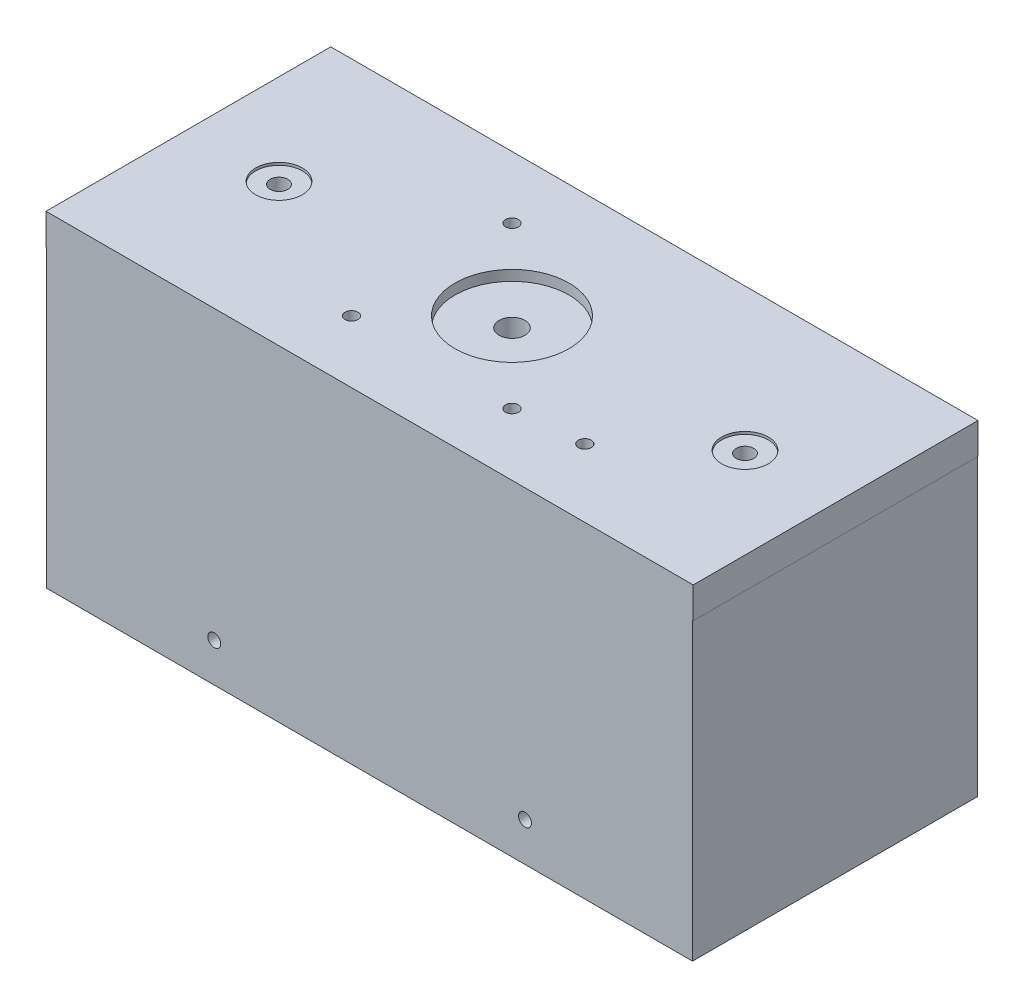
ISO-10303-21;
HEADER;
FILE_DESCRIPTION(('STEP AP214'),'2;1');
FILE_NAME('part.step','',(''),(''),'','','');
FILE_SCHEMA(('AUTOMOTIVE_DESIGN { 1 0 10303 214 1 1 1 1 }'));
ENDSEC;
DATA;
#1=APPLICATION_CONTEXT('core data for automotive mechanical design processes');
#2=APPLICATION_PROTOCOL_DEFINITION('international standard','automotive_design',2000,#1);
#3=PRODUCT_CONTEXT('',#1,'mechanical');
#4=PRODUCT('Part','Part','',(#3));
#5=PRODUCT_RELATED_PRODUCT_CATEGORY('part','',(#4));
#6=PRODUCT_DEFINITION_FORMATION('','',#4);
#7=PRODUCT_DEFINITION_CONTEXT('part definition',#1,'design');
#8=PRODUCT_DEFINITION('design','',#6,#7);
#9=PRODUCT_DEFINITION_SHAPE('','',#8);
#10=(LENGTH_UNIT() NAMED_UNIT(*) SI_UNIT(.MILLI.,.METRE.));
#11=(NAMED_UNIT(*) PLANE_ANGLE_UNIT() SI_UNIT($,.RADIAN.));
#12=(NAMED_UNIT(*) SI_UNIT($,.STERADIAN.) SOLID_ANGLE_UNIT());
#13=UNCERTAINTY_MEASURE_WITH_UNIT(LENGTH_MEASURE(1.E-05),#10,'distance_accuracy_value','');
#14=(GEOMETRIC_REPRESENTATION_CONTEXT(3) GLOBAL_UNCERTAINTY_ASSIGNED_CONTEXT((#13)) GLOBAL_UNIT_ASSIGNED_CONTEXT((#10,
#11,#12)) REPRESENTATION_CONTEXT('',''));
#15=CARTESIAN_POINT('',(0.,0.,0.));
#16=DIRECTION('',(0.,0.,1.));
#17=DIRECTION('',(1.,0.,0.));
#18=AXIS2_PLACEMENT_3D('',#15,#16,#17);
#19=CARTESIAN_POINT('',(0.,0.,0.));
#20=DIRECTION('',(0.,1.,0.));
#21=DIRECTION('',(0.,0.,1.));
#22=AXIS2_PLACEMENT_3D('',#19,#20,#21);
#23=PLANE('',#22);
#24=DIRECTION('',(0.,0.,-1.));
#25=VECTOR('',#24,1.);
#26=CARTESIAN_POINT('',(-62.3619957512419,0.,-27.5));
#27=LINE('',#26,#25);
#28=CARTESIAN_POINT('',(-62.3619957512419,0.,27.5));
#29=VERTEX_POINT('',#28);
#30=CARTESIAN_POINT('',(-62.3619957512419,0.,-27.5));
#31=VERTEX_POINT('',#30);
#32=EDGE_CURVE('E146',#29,#31,#27,.T.);
#33=ORIENTED_EDGE('',*,*,#32,.F.);
#34=DIRECTION('',(1.,0.,0.));
#35=VECTOR('',#34,1.);
#36=CARTESIAN_POINT('',(-62.5,0.,27.5));
#37=LINE('',#36,#35);
#38=CARTESIAN_POINT('',(-62.5,0.,27.5));
#39=VERTEX_POINT('',#38);
#40=EDGE_CURVE('E236',#39,#29,#37,.T.);
#41=ORIENTED_EDGE('',*,*,#40,.F.);
#42=DIRECTION('',(0.,0.,1.));
#43=VECTOR('',#42,1.);
#44=CARTESIAN_POINT('',(-62.5,0.,-27.5));
#45=LINE('',#44,#43);
#46=CARTESIAN_POINT('',(-62.5,0.,-27.5));
#47=VERTEX_POINT('',#46);
#48=EDGE_CURVE('E248',#47,#39,#45,.T.);
#49=ORIENTED_EDGE('',*,*,#48,.F.);
#50=DIRECTION('',(-1.,0.,0.));
#51=VECTOR('',#50,1.);
#52=CARTESIAN_POINT('',(-62.5,0.,-27.5));
#53=LINE('',#52,#51);
#54=EDGE_CURVE('E63',#31,#47,#53,.T.);
#55=ORIENTED_EDGE('',*,*,#54,.F.);
#56=EDGE_LOOP('',(#33,#41,#49,#55));
#57=FACE_BOUND('',#56,.T.);
#58=ADVANCED_FACE('F38',(#57),#23,.F.);
#59=DIRECTION('',(0.,0.,1.));
#60=VECTOR('',#59,1.);
#61=CARTESIAN_POINT('',(62.3619957512418,0.,-27.5));
#62=LINE('',#61,#60);
#63=CARTESIAN_POINT('',(62.3619957512418,0.,-27.5));
#64=VERTEX_POINT('',#63);
#65=CARTESIAN_POINT('',(62.3619957512418,0.,27.5));
#66=VERTEX_POINT('',#65);
#67=EDGE_CURVE('E176',#64,#66,#62,.T.);
#68=ORIENTED_EDGE('',*,*,#67,.F.);
#69=CARTESIAN_POINT('',(62.5,0.,-27.5));
#70=VERTEX_POINT('',#69);
#71=EDGE_CURVE('E245',#70,#64,#53,.T.);
#72=ORIENTED_EDGE('',*,*,#71,.F.);
#73=DIRECTION('',(0.,0.,-1.));
#74=VECTOR('',#73,1.);
#75=CARTESIAN_POINT('',(62.5,0.,-27.5));
#76=LINE('',#75,#74);
#77=CARTESIAN_POINT('',(62.5,0.,27.5));
#78=VERTEX_POINT('',#77);
#79=EDGE_CURVE('E229',#78,#70,#76,.T.);
#80=ORIENTED_EDGE('',*,*,#79,.F.);
#81=EDGE_CURVE('E250',#66,#78,#37,.T.);
#82=ORIENTED_EDGE('',*,*,#81,.F.);
#83=EDGE_LOOP('',(#68,#72,#80,#82));
#84=FACE_BOUND('',#83,.T.);
#85=ADVANCED_FACE('F316',(#84),#23,.F.);
#86=CARTESIAN_POINT('',(62.5,6.,-27.5));
#87=DIRECTION('',(-1.,0.,0.));
#88=DIRECTION('',(0.,0.,1.));
#89=AXIS2_PLACEMENT_3D('',#86,#87,#88);
#90=PLANE('',#89);
#91=ORIENTED_EDGE('',*,*,#79,.T.);
#92=DIRECTION('',(0.,-1.,0.));
#93=VECTOR('',#92,1.);
#94=CARTESIAN_POINT('',(62.5,6.,-27.5));
#95=LINE('',#94,#93);
#96=CARTESIAN_POINT('',(62.5,6.,-27.5));
#97=VERTEX_POINT('',#96);
#98=EDGE_CURVE('E11',#97,#70,#95,.T.);
#99=ORIENTED_EDGE('',*,*,#98,.F.);
#100=DIRECTION('',(0.,0.,-1.));
#101=VECTOR('',#100,1.);
#102=CARTESIAN_POINT('',(62.5,6.,-27.5));
#103=LINE('',#102,#101);
#104=CARTESIAN_POINT('',(62.5,6.,27.5));
#105=VERTEX_POINT('',#104);
#106=EDGE_CURVE('E232',#105,#97,#103,.T.);
#107=ORIENTED_EDGE('',*,*,#106,.F.);
#108=DIRECTION('',(0.,-1.,0.));
#109=VECTOR('',#108,1.);
#110=CARTESIAN_POINT('',(62.5,6.,27.5));
#111=LINE('',#110,#109);
#112=EDGE_CURVE('E242',#105,#78,#111,.T.);
#113=ORIENTED_EDGE('',*,*,#112,.T.);
#114=EDGE_LOOP('',(#91,#99,#107,#113));
#115=FACE_BOUND('',#114,.T.);
#116=ADVANCED_FACE('F40',(#115),#90,.F.);
#117=CARTESIAN_POINT('',(-62.5,6.,-27.5));
#118=DIRECTION('',(0.,0.,1.));
#119=DIRECTION('',(1.,0.,0.));
#120=AXIS2_PLACEMENT_3D('',#117,#118,#119);
#121=PLANE('',#120);
#122=CARTESIAN_POINT('',(-30.,-49.5,-27.5));
#123=DIRECTION('',(0.,0.,-1.));
#124=DIRECTION('',(-1.,0.,0.));
#125=AXIS2_PLACEMENT_3D('',#122,#123,#124);
#126=CIRCLE('',#125,1.24999999999999);
#127=CARTESIAN_POINT('',(-31.25,-49.5,-27.5));
#128=VERTEX_POINT('',#127);
#129=EDGE_CURVE('E288',#128,#128,#126,.T.);
#130=ORIENTED_EDGE('',*,*,#129,.F.);
#131=EDGE_LOOP('',(#130));
#132=FACE_BOUND('',#131,.T.);
#133=CARTESIAN_POINT('',(30.,-49.5,-27.5));
#134=DIRECTION('',(0.,0.,-1.));
#135=DIRECTION('',(-1.,0.,0.));
#136=AXIS2_PLACEMENT_3D('',#133,#134,#135);
#137=CIRCLE('',#136,1.24999999999999);
#138=CARTESIAN_POINT('',(28.75,-49.5,-27.5));
#139=VERTEX_POINT('',#138);
#140=EDGE_CURVE('E294',#139,#139,#137,.T.);
#141=ORIENTED_EDGE('',*,*,#140,.F.);
#142=EDGE_LOOP('',(#141));
#143=FACE_BOUND('',#142,.T.);
#144=ORIENTED_EDGE('',*,*,#71,.T.);
#145=DIRECTION('',(0.,1.,0.));
#146=VECTOR('',#145,1.);
#147=CARTESIAN_POINT('',(62.3619957512418,-57.,-27.5));
#148=LINE('',#147,#146);
#149=CARTESIAN_POINT('',(62.3619957512418,-57.,-27.5));
#150=VERTEX_POINT('',#149);
#151=EDGE_CURVE('E192',#150,#64,#148,.T.);
#152=ORIENTED_EDGE('',*,*,#151,.F.);
#153=DIRECTION('',(1.,0.,0.));
#154=VECTOR('',#153,1.);
#155=CARTESIAN_POINT('',(62.3619957512418,-57.,-27.5));
#156=LINE('',#155,#154);
#157=CARTESIAN_POINT('',(-62.3619957512419,-57.,-27.5));
#158=VERTEX_POINT('',#157);
#159=EDGE_CURVE('E175',#158,#150,#156,.T.);
#160=ORIENTED_EDGE('',*,*,#159,.F.);
#161=DIRECTION('',(0.,1.,0.));
#162=VECTOR('',#161,1.);
#163=CARTESIAN_POINT('',(-62.3619957512419,-57.,-27.5));
#164=LINE('',#163,#162);
#165=EDGE_CURVE('E195',#158,#31,#164,.T.);
#166=ORIENTED_EDGE('',*,*,#165,.T.);
#167=ORIENTED_EDGE('',*,*,#54,.T.);
#168=DIRECTION('',(0.,-1.,0.));
#169=VECTOR('',#168,1.);
#170=CARTESIAN_POINT('',(-62.5,6.,-27.5));
#171=LINE('',#170,#169);
#172=CARTESIAN_POINT('',(-62.5,6.,-27.5));
#173=VERTEX_POINT('',#172);
#174=EDGE_CURVE('E47',#173,#47,#171,.T.);
#175=ORIENTED_EDGE('',*,*,#174,.F.);
#176=DIRECTION('',(-1.,0.,0.));
#177=VECTOR('',#176,1.);
#178=CARTESIAN_POINT('',(-62.5,6.,-27.5));
#179=LINE('',#178,#177);
#180=EDGE_CURVE('E235',#97,#173,#179,.T.);
#181=ORIENTED_EDGE('',*,*,#180,.F.);
#182=ORIENTED_EDGE('',*,*,#98,.T.);
#183=EDGE_LOOP('',(#144,#152,#160,#166,#167,#175,#181,#182));
#184=FACE_BOUND('',#183,.T.);
#185=ADVANCED_FACE('F395',(#132,#143,#184),#121,.F.);
#186=CARTESIAN_POINT('',(-62.5,6.,-27.5));
#187=DIRECTION('',(1.,0.,0.));
#188=DIRECTION('',(0.,0.,-1.));
#189=AXIS2_PLACEMENT_3D('',#186,#187,#188);
#190=PLANE('',#189);
#191=ORIENTED_EDGE('',*,*,#48,.T.);
#192=DIRECTION('',(0.,-1.,0.));
#193=VECTOR('',#192,1.);
#194=CARTESIAN_POINT('',(-62.5,6.,27.5));
#195=LINE('',#194,#193);
#196=CARTESIAN_POINT('',(-62.5,6.,27.5));
#197=VERTEX_POINT('',#196);
#198=EDGE_CURVE('E255',#197,#39,#195,.T.);
#199=ORIENTED_EDGE('',*,*,#198,.F.);
#200=DIRECTION('',(0.,0.,1.));
#201=VECTOR('',#200,1.);
#202=CARTESIAN_POINT('',(-62.5,6.,-27.5));
#203=LINE('',#202,#201);
#204=EDGE_CURVE('E238',#173,#197,#203,.T.);
#205=ORIENTED_EDGE('',*,*,#204,.F.);
#206=ORIENTED_EDGE('',*,*,#174,.T.);
#207=EDGE_LOOP('',(#191,#199,#205,#206));
#208=FACE_BOUND('',#207,.T.);
#209=ADVANCED_FACE('F404',(#208),#190,.F.);
#210=CARTESIAN_POINT('',(-62.5,6.,27.5));
#211=DIRECTION('',(0.,0.,-1.));
#212=DIRECTION('',(-1.,0.,0.));
#213=AXIS2_PLACEMENT_3D('',#210,#211,#212);
#214=PLANE('',#213);
#215=CARTESIAN_POINT('',(30.,-49.5,27.5));
#216=DIRECTION('',(0.,0.,1.));
#217=DIRECTION('',(1.,0.,0.));
#218=AXIS2_PLACEMENT_3D('',#215,#216,#217);
#219=CIRCLE('',#218,1.24999999999999);
#220=CARTESIAN_POINT('',(31.25,-49.5,27.5));
#221=VERTEX_POINT('',#220);
#222=EDGE_CURVE('E263',#221,#221,#219,.T.);
#223=ORIENTED_EDGE('',*,*,#222,.F.);
#224=EDGE_LOOP('',(#223));
#225=FACE_BOUND('',#224,.T.);
#226=CARTESIAN_POINT('',(-30.,-49.5,27.5));
#227=DIRECTION('',(0.,0.,1.));
#228=DIRECTION('',(1.,0.,0.));
#229=AXIS2_PLACEMENT_3D('',#226,#227,#228);
#230=CIRCLE('',#229,1.24999999999999);
#231=CARTESIAN_POINT('',(-28.75,-49.5,27.5));
#232=VERTEX_POINT('',#231);
#233=EDGE_CURVE('E282',#232,#232,#230,.T.);
#234=ORIENTED_EDGE('',*,*,#233,.F.);
#235=EDGE_LOOP('',(#234));
#236=FACE_BOUND('',#235,.T.);
#237=ORIENTED_EDGE('',*,*,#40,.T.);
#238=DIRECTION('',(0.,1.,0.));
#239=VECTOR('',#238,1.);
#240=CARTESIAN_POINT('',(-62.3619957512419,-57.,27.5));
#241=LINE('',#240,#239);
#242=CARTESIAN_POINT('',(-62.3619957512419,-57.,27.5));
#243=VERTEX_POINT('',#242);
#244=EDGE_CURVE('E182',#243,#29,#241,.T.);
#245=ORIENTED_EDGE('',*,*,#244,.F.);
#246=DIRECTION('',(-1.,0.,0.));
#247=VECTOR('',#246,1.);
#248=CARTESIAN_POINT('',(62.3619957512418,-57.,27.5));
#249=LINE('',#248,#247);
#250=CARTESIAN_POINT('',(62.3619957512418,-57.,27.5));
#251=VERTEX_POINT('',#250);
#252=EDGE_CURVE('E180',#251,#243,#249,.T.);
#253=ORIENTED_EDGE('',*,*,#252,.F.);
#254=DIRECTION('',(0.,1.,0.));
#255=VECTOR('',#254,1.);
#256=CARTESIAN_POINT('',(62.3619957512418,-57.,27.5));
#257=LINE('',#256,#255);
#258=EDGE_CURVE('E189',#251,#66,#257,.T.);
#259=ORIENTED_EDGE('',*,*,#258,.T.);
#260=ORIENTED_EDGE('',*,*,#81,.T.);
#261=ORIENTED_EDGE('',*,*,#112,.F.);
#262=DIRECTION('',(1.,0.,0.));
#263=VECTOR('',#262,1.);
#264=CARTESIAN_POINT('',(-62.5,6.,27.5));
#265=LINE('',#264,#263);
#266=EDGE_CURVE('E240',#197,#105,#265,.T.);
#267=ORIENTED_EDGE('',*,*,#266,.F.);
#268=ORIENTED_EDGE('',*,*,#198,.T.);
#269=EDGE_LOOP('',(#237,#245,#253,#259,#260,#261,#267,#268));
#270=FACE_BOUND('',#269,.T.);
#271=ADVANCED_FACE('F336',(#225,#236,#270),#214,.F.);
#272=CARTESIAN_POINT('',(0.,6.,0.));
#273=DIRECTION('',(0.,1.,0.));
#274=DIRECTION('',(0.,0.,1.));
#275=AXIS2_PLACEMENT_3D('',#272,#273,#274);
#276=PLANE('',#275);
#277=CARTESIAN_POINT('',(-45.,6.,0.));
#278=DIRECTION('',(0.,1.,0.));
#279=DIRECTION('',(0.,0.,1.));
#280=AXIS2_PLACEMENT_3D('',#277,#278,#279);
#281=CIRCLE('',#280,4.49999999999999);
#282=CARTESIAN_POINT('',(-45.,6.,4.5));
#283=VERTEX_POINT('',#282);
#284=EDGE_CURVE('E494',#283,#283,#281,.T.);
#285=ORIENTED_EDGE('',*,*,#284,.F.);
#286=EDGE_LOOP('',(#285));
#287=FACE_BOUND('',#286,.T.);
#288=CARTESIAN_POINT('',(45.,6.,0.));
#289=DIRECTION('',(0.,1.,0.));
#290=DIRECTION('',(0.,0.,1.));
#291=AXIS2_PLACEMENT_3D('',#288,#289,#290);
#292=CIRCLE('',#291,4.49999999999999);
#293=CARTESIAN_POINT('',(45.,6.,4.49999999999999));
#294=VERTEX_POINT('',#293);
#295=EDGE_CURVE('E504',#294,#294,#292,.T.);
#296=ORIENTED_EDGE('',*,*,#295,.F.);
#297=EDGE_LOOP('',(#296));
#298=FACE_BOUND('',#297,.T.);
#299=CARTESIAN_POINT('',(28.4442697657839,6.,14.3794846236689));
#300=DIRECTION('',(0.,1.,0.));
#301=DIRECTION('',(0.,0.,1.));
#302=AXIS2_PLACEMENT_3D('',#299,#300,#301);
#303=CIRCLE('',#302,1.24999999999999);
#304=CARTESIAN_POINT('',(28.4442697657839,6.,15.6294846236688));
#305=VERTEX_POINT('',#304);
#306=EDGE_CURVE('E197',#305,#305,#303,.T.);
#307=ORIENTED_EDGE('',*,*,#306,.F.);
#308=EDGE_LOOP('',(#307));
#309=FACE_BOUND('',#308,.T.);
#310=CARTESIAN_POINT('',(15.5,6.,15.5));
#311=DIRECTION('',(0.,1.,0.));
#312=DIRECTION('',(0.,0.,1.));
#313=AXIS2_PLACEMENT_3D('',#310,#311,#312);
#314=CIRCLE('',#313,1.24999999999999);
#315=CARTESIAN_POINT('',(15.5,6.,16.75));
#316=VERTEX_POINT('',#315);
#317=EDGE_CURVE('E203',#316,#316,#314,.T.);
#318=ORIENTED_EDGE('',*,*,#317,.F.);
#319=EDGE_LOOP('',(#318));
#320=FACE_BOUND('',#319,.T.);
#321=CARTESIAN_POINT('',(-15.5,6.,15.5));
#322=DIRECTION('',(0.,1.,0.));
#323=DIRECTION('',(0.,0.,1.));
#324=AXIS2_PLACEMENT_3D('',#321,#322,#323);
#325=CIRCLE('',#324,1.24999999999999);
#326=CARTESIAN_POINT('',(-15.5,6.,16.75));
#327=VERTEX_POINT('',#326);
#328=EDGE_CURVE('E209',#327,#327,#325,.T.);
#329=ORIENTED_EDGE('',*,*,#328,.F.);
#330=EDGE_LOOP('',(#329));
#331=FACE_BOUND('',#330,.T.);
#332=CARTESIAN_POINT('',(-15.5,6.,-15.5));
#333=DIRECTION('',(0.,1.,0.));
#334=DIRECTION('',(0.,0.,1.));
#335=AXIS2_PLACEMENT_3D('',#332,#333,#334);
#336=CIRCLE('',#335,1.24999999999999);
#337=CARTESIAN_POINT('',(-15.5,6.,-14.25));
#338=VERTEX_POINT('',#337);
#339=EDGE_CURVE('E215',#338,#338,#336,.T.);
#340=ORIENTED_EDGE('',*,*,#339,.F.);
#341=EDGE_LOOP('',(#340));
#342=FACE_BOUND('',#341,.T.);
#343=CARTESIAN_POINT('',(0.,6.,0.));
#344=DIRECTION('',(0.,1.,0.));
#345=DIRECTION('',(0.,0.,1.));
#346=AXIS2_PLACEMENT_3D('',#343,#344,#345);
#347=CIRCLE('',#346,11.);
#348=CARTESIAN_POINT('',(0.,6.,11.));
#349=VERTEX_POINT('',#348);
#350=EDGE_CURVE('E225',#349,#349,#347,.T.);
#351=ORIENTED_EDGE('',*,*,#350,.F.);
#352=EDGE_LOOP('',(#351));
#353=FACE_BOUND('',#352,.T.);
#354=ORIENTED_EDGE('',*,*,#106,.T.);
#355=ORIENTED_EDGE('',*,*,#180,.T.);
#356=ORIENTED_EDGE('',*,*,#204,.T.);
#357=ORIENTED_EDGE('',*,*,#266,.T.);
#358=EDGE_LOOP('',(#354,#355,#356,#357));
#359=FACE_BOUND('',#358,.T.);
#360=ADVANCED_FACE('F327',(#287,#298,#309,#320,#331,#342,#353,#359),#276,.T.);
#361=CARTESIAN_POINT('',(-45.,0.,0.));
#362=DIRECTION('',(0.,1.,0.));
#363=DIRECTION('',(0.,0.,1.));
#364=AXIS2_PLACEMENT_3D('',#361,#362,#363);
#365=CIRCLE('',#364,0.0357205176494837);
#366=CARTESIAN_POINT('',(-45.,0.,0.0357205176494893));
#367=VERTEX_POINT('',#366);
#368=EDGE_CURVE('E42',#367,#367,#365,.T.);
#369=ORIENTED_EDGE('',*,*,#368,.T.);
#370=EDGE_LOOP('',(#369));
#371=FACE_BOUND('',#370,.T.);
#372=CARTESIAN_POINT('',(45.,0.,0.));
#373=DIRECTION('',(0.,1.,0.));
#374=DIRECTION('',(0.,0.,1.));
#375=AXIS2_PLACEMENT_3D('',#372,#373,#374);
#376=CIRCLE('',#375,0.0357205176494837);
#377=CARTESIAN_POINT('',(45.,0.,0.0357205176494838));
#378=VERTEX_POINT('',#377);
#379=EDGE_CURVE('E261',#378,#378,#376,.T.);
#380=ORIENTED_EDGE('',*,*,#379,.T.);
#381=EDGE_LOOP('',(#380));
#382=FACE_BOUND('',#381,.T.);
#383=DIRECTION('',(-1.,0.,0.));
#384=VECTOR('',#383,1.);
#385=CARTESIAN_POINT('',(60.,0.,25.));
#386=LINE('',#385,#384);
#387=CARTESIAN_POINT('',(60.,0.,25.));
#388=VERTEX_POINT('',#387);
#389=CARTESIAN_POINT('',(-60.,0.,25.));
#390=VERTEX_POINT('',#389);
#391=EDGE_CURVE('E139',#388,#390,#386,.T.);
#392=ORIENTED_EDGE('',*,*,#391,.T.);
#393=DIRECTION('',(0.,0.,-1.));
#394=VECTOR('',#393,1.);
#395=CARTESIAN_POINT('',(-60.,0.,-25.));
#396=LINE('',#395,#394);
#397=CARTESIAN_POINT('',(-60.,0.,-25.));
#398=VERTEX_POINT('',#397);
#399=EDGE_CURVE('E159',#390,#398,#396,.T.);
#400=ORIENTED_EDGE('',*,*,#399,.T.);
#401=DIRECTION('',(1.,0.,0.));
#402=VECTOR('',#401,1.);
#403=CARTESIAN_POINT('',(60.,0.,-25.));
#404=LINE('',#403,#402);
#405=CARTESIAN_POINT('',(60.,0.,-25.));
#406=VERTEX_POINT('',#405);
#407=EDGE_CURVE('E145',#398,#406,#404,.T.);
#408=ORIENTED_EDGE('',*,*,#407,.T.);
#409=DIRECTION('',(0.,0.,1.));
#410=VECTOR('',#409,1.);
#411=CARTESIAN_POINT('',(60.,0.,-25.));
#412=LINE('',#411,#410);
#413=EDGE_CURVE('E163',#406,#388,#412,.T.);
#414=ORIENTED_EDGE('',*,*,#413,.T.);
#415=EDGE_LOOP('',(#392,#400,#408,#414));
#416=FACE_BOUND('',#415,.T.);
#417=CARTESIAN_POINT('',(28.4442697657839,0.,14.3794846236689));
#418=DIRECTION('',(0.,1.,0.));
#419=DIRECTION('',(0.,0.,1.));
#420=AXIS2_PLACEMENT_3D('',#417,#418,#419);
#421=CIRCLE('',#420,1.24999999999999);
#422=CARTESIAN_POINT('',(28.4442697657839,0.,15.6294846236688));
#423=VERTEX_POINT('',#422);
#424=EDGE_CURVE('E200',#423,#423,#421,.T.);
#425=ORIENTED_EDGE('',*,*,#424,.T.);
#426=EDGE_LOOP('',(#425));
#427=FACE_BOUND('',#426,.T.);
#428=CARTESIAN_POINT('',(15.5,0.,15.5));
#429=DIRECTION('',(0.,1.,0.));
#430=DIRECTION('',(0.,0.,1.));
#431=AXIS2_PLACEMENT_3D('',#428,#429,#430);
#432=CIRCLE('',#431,1.24999999999999);
#433=CARTESIAN_POINT('',(15.5,0.,16.75));
#434=VERTEX_POINT('',#433);
#435=EDGE_CURVE('E206',#434,#434,#432,.T.);
#436=ORIENTED_EDGE('',*,*,#435,.T.);
#437=EDGE_LOOP('',(#436));
#438=FACE_BOUND('',#437,.T.);
#439=CARTESIAN_POINT('',(-15.5,0.,15.5));
#440=DIRECTION('',(0.,1.,0.));
#441=DIRECTION('',(0.,0.,1.));
#442=AXIS2_PLACEMENT_3D('',#439,#440,#441);
#443=CIRCLE('',#442,1.24999999999999);
#444=CARTESIAN_POINT('',(-15.5,0.,16.75));
#445=VERTEX_POINT('',#444);
#446=EDGE_CURVE('E212',#445,#445,#443,.T.);
#447=ORIENTED_EDGE('',*,*,#446,.T.);
#448=EDGE_LOOP('',(#447));
#449=FACE_BOUND('',#448,.T.);
#450=CARTESIAN_POINT('',(-15.5,0.,-15.5));
#451=DIRECTION('',(0.,1.,0.));
#452=DIRECTION('',(0.,0.,1.));
#453=AXIS2_PLACEMENT_3D('',#450,#451,#452);
#454=CIRCLE('',#453,1.24999999999999);
#455=CARTESIAN_POINT('',(-15.5,0.,-14.25));
#456=VERTEX_POINT('',#455);
#457=EDGE_CURVE('E218',#456,#456,#454,.T.);
#458=ORIENTED_EDGE('',*,*,#457,.T.);
#459=EDGE_LOOP('',(#458));
#460=FACE_BOUND('',#459,.T.);
#461=CARTESIAN_POINT('',(0.,0.,0.));
#462=DIRECTION('',(0.,1.,0.));
#463=DIRECTION('',(0.,0.,1.));
#464=AXIS2_PLACEMENT_3D('',#461,#462,#463);
#465=CIRCLE('',#464,2.5);
#466=CARTESIAN_POINT('',(0.,0.,2.5));
#467=VERTEX_POINT('',#466);
#468=EDGE_CURVE('E222',#467,#467,#465,.F.);
#469=ORIENTED_EDGE('',*,*,#468,.F.);
#470=EDGE_LOOP('',(#469));
#471=FACE_BOUND('',#470,.T.);
#472=ADVANCED_FACE('F318',(#371,#382,#416,#427,#438,#449,#460,#471),#23,.F.);
#473=CARTESIAN_POINT('',(0.,4.,0.));
#474=DIRECTION('',(0.,1.,0.));
#475=DIRECTION('',(0.,0.,1.));
#476=AXIS2_PLACEMENT_3D('',#473,#474,#475);
#477=CYLINDRICAL_SURFACE('',#476,11.);
#478=CARTESIAN_POINT('',(0.,4.,0.));
#479=DIRECTION('',(0.,1.,0.));
#480=DIRECTION('',(0.,0.,1.));
#481=AXIS2_PLACEMENT_3D('',#478,#479,#480);
#482=CIRCLE('',#481,11.);
#483=CARTESIAN_POINT('',(0.,4.,11.));
#484=VERTEX_POINT('',#483);
#485=EDGE_CURVE('E226',#484,#484,#482,.T.);
#486=ORIENTED_EDGE('',*,*,#485,.F.);
#487=EDGE_LOOP('',(#486));
#488=FACE_BOUND('',#487,.T.);
#489=ORIENTED_EDGE('',*,*,#350,.T.);
#490=EDGE_LOOP('',(#489));
#491=FACE_BOUND('',#490,.T.);
#492=ADVANCED_FACE('F326',(#488,#491),#477,.F.);
#493=CARTESIAN_POINT('',(0.,4.,0.));
#494=DIRECTION('',(0.,1.,0.));
#495=DIRECTION('',(0.,0.,1.));
#496=AXIS2_PLACEMENT_3D('',#493,#494,#495);
#497=PLANE('',#496);
#498=CARTESIAN_POINT('',(0.,4.,0.));
#499=DIRECTION('',(0.,1.,0.));
#500=DIRECTION('',(0.,0.,1.));
#501=AXIS2_PLACEMENT_3D('',#498,#499,#500);
#502=CIRCLE('',#501,2.5);
#503=CARTESIAN_POINT('',(0.,4.,2.5));
#504=VERTEX_POINT('',#503);
#505=EDGE_CURVE('E219',#504,#504,#502,.T.);
#506=ORIENTED_EDGE('',*,*,#505,.F.);
#507=EDGE_LOOP('',(#506));
#508=FACE_BOUND('',#507,.T.);
#509=ORIENTED_EDGE('',*,*,#485,.T.);
#510=EDGE_LOOP('',(#509));
#511=FACE_BOUND('',#510,.T.);
#512=ADVANCED_FACE('F333',(#508,#511),#497,.T.);
#513=CARTESIAN_POINT('',(0.,-0.00100000000000013,0.));
#514=DIRECTION('',(0.,1.,0.));
#515=DIRECTION('',(0.,0.,1.));
#516=AXIS2_PLACEMENT_3D('',#513,#514,#515);
#517=CYLINDRICAL_SURFACE('',#516,2.5);
#518=ORIENTED_EDGE('',*,*,#505,.T.);
#519=EDGE_LOOP('',(#518));
#520=FACE_BOUND('',#519,.T.);
#521=ORIENTED_EDGE('',*,*,#468,.T.);
#522=EDGE_LOOP('',(#521));
#523=FACE_BOUND('',#522,.T.);
#524=ADVANCED_FACE('F352',(#520,#523),#517,.F.);
#525=CARTESIAN_POINT('',(-15.5,6.,-15.5));
#526=DIRECTION('',(0.,1.,0.));
#527=DIRECTION('',(0.,0.,1.));
#528=AXIS2_PLACEMENT_3D('',#525,#526,#527);
#529=CYLINDRICAL_SURFACE('',#528,1.24999999999999);
#530=ORIENTED_EDGE('',*,*,#339,.T.);
#531=EDGE_LOOP('',(#530));
#532=FACE_BOUND('',#531,.T.);
#533=ORIENTED_EDGE('',*,*,#457,.F.);
#534=EDGE_LOOP('',(#533));
#535=FACE_BOUND('',#534,.T.);
#536=ADVANCED_FACE('F354',(#532,#535),#529,.F.);
#537=CARTESIAN_POINT('',(-15.5,6.,15.5));
#538=DIRECTION('',(0.,1.,0.));
#539=DIRECTION('',(0.,0.,1.));
#540=AXIS2_PLACEMENT_3D('',#537,#538,#539);
#541=CYLINDRICAL_SURFACE('',#540,1.24999999999999);
#542=ORIENTED_EDGE('',*,*,#328,.T.);
#543=EDGE_LOOP('',(#542));
#544=FACE_BOUND('',#543,.T.);
#545=ORIENTED_EDGE('',*,*,#446,.F.);
#546=EDGE_LOOP('',(#545));
#547=FACE_BOUND('',#546,.T.);
#548=ADVANCED_FACE('F361',(#544,#547),#541,.F.);
#549=CARTESIAN_POINT('',(15.5,6.,15.5));
#550=DIRECTION('',(0.,1.,0.));
#551=DIRECTION('',(0.,0.,1.));
#552=AXIS2_PLACEMENT_3D('',#549,#550,#551);
#553=CYLINDRICAL_SURFACE('',#552,1.24999999999999);
#554=ORIENTED_EDGE('',*,*,#317,.T.);
#555=EDGE_LOOP('',(#554));
#556=FACE_BOUND('',#555,.T.);
#557=ORIENTED_EDGE('',*,*,#435,.F.);
#558=EDGE_LOOP('',(#557));
#559=FACE_BOUND('',#558,.T.);
#560=ADVANCED_FACE('F369',(#556,#559),#553,.F.);
#561=CARTESIAN_POINT('',(28.4442697657839,6.,14.3794846236689));
#562=DIRECTION('',(0.,1.,0.));
#563=DIRECTION('',(0.,0.,1.));
#564=AXIS2_PLACEMENT_3D('',#561,#562,#563);
#565=CYLINDRICAL_SURFACE('',#564,1.24999999999999);
#566=ORIENTED_EDGE('',*,*,#306,.T.);
#567=EDGE_LOOP('',(#566));
#568=FACE_BOUND('',#567,.T.);
#569=ORIENTED_EDGE('',*,*,#424,.F.);
#570=EDGE_LOOP('',(#569));
#571=FACE_BOUND('',#570,.T.);
#572=ADVANCED_FACE('F373',(#568,#571),#565,.F.);
#573=CARTESIAN_POINT('',(0.,-57.,0.));
#574=DIRECTION('',(0.,-1.,0.));
#575=DIRECTION('',(0.,0.,-1.));
#576=AXIS2_PLACEMENT_3D('',#573,#574,#575);
#577=PLANE('',#576);
#578=DIRECTION('',(0.,0.,-1.));
#579=VECTOR('',#578,1.);
#580=CARTESIAN_POINT('',(-62.3619957512419,-57.,-27.5));
#581=LINE('',#580,#579);
#582=EDGE_CURVE('E172',#243,#158,#581,.T.);
#583=ORIENTED_EDGE('',*,*,#582,.T.);
#584=ORIENTED_EDGE('',*,*,#159,.T.);
#585=DIRECTION('',(0.,0.,1.));
#586=VECTOR('',#585,1.);
#587=CARTESIAN_POINT('',(62.3619957512418,-57.,-27.5));
#588=LINE('',#587,#586);
#589=EDGE_CURVE('E178',#150,#251,#588,.T.);
#590=ORIENTED_EDGE('',*,*,#589,.T.);
#591=ORIENTED_EDGE('',*,*,#252,.T.);
#592=EDGE_LOOP('',(#583,#584,#590,#591));
#593=FACE_BOUND('',#592,.T.);
#594=DIRECTION('',(1.,0.,0.));
#595=VECTOR('',#594,1.);
#596=CARTESIAN_POINT('',(60.,-57.,-25.));
#597=LINE('',#596,#595);
#598=CARTESIAN_POINT('',(-60.,-57.,-25.));
#599=VERTEX_POINT('',#598);
#600=CARTESIAN_POINT('',(60.,-57.,-25.));
#601=VERTEX_POINT('',#600);
#602=EDGE_CURVE('E138',#599,#601,#597,.T.);
#603=ORIENTED_EDGE('',*,*,#602,.F.);
#604=DIRECTION('',(0.,0.,-1.));
#605=VECTOR('',#604,1.);
#606=CARTESIAN_POINT('',(-60.,-57.,-25.));
#607=LINE('',#606,#605);
#608=CARTESIAN_POINT('',(-60.,-57.,25.));
#609=VERTEX_POINT('',#608);
#610=EDGE_CURVE('E130',#609,#599,#607,.T.);
#611=ORIENTED_EDGE('',*,*,#610,.F.);
#612=DIRECTION('',(-1.,0.,0.));
#613=VECTOR('',#612,1.);
#614=CARTESIAN_POINT('',(60.,-57.,25.));
#615=LINE('',#614,#613);
#616=CARTESIAN_POINT('',(60.,-57.,25.));
#617=VERTEX_POINT('',#616);
#618=EDGE_CURVE('E154',#617,#609,#615,.T.);
#619=ORIENTED_EDGE('',*,*,#618,.F.);
#620=DIRECTION('',(0.,0.,1.));
#621=VECTOR('',#620,1.);
#622=CARTESIAN_POINT('',(60.,-57.,-25.));
#623=LINE('',#622,#621);
#624=EDGE_CURVE('E152',#601,#617,#623,.T.);
#625=ORIENTED_EDGE('',*,*,#624,.F.);
#626=EDGE_LOOP('',(#603,#611,#619,#625));
#627=FACE_BOUND('',#626,.T.);
#628=ADVANCED_FACE('F150',(#593,#627),#577,.T.);
#629=CARTESIAN_POINT('',(-62.3619957512419,-57.,-27.5));
#630=DIRECTION('',(1.,0.,0.));
#631=DIRECTION('',(0.,0.,-1.));
#632=AXIS2_PLACEMENT_3D('',#629,#630,#631);
#633=PLANE('',#632);
#634=ORIENTED_EDGE('',*,*,#32,.T.);
#635=ORIENTED_EDGE('',*,*,#165,.F.);
#636=ORIENTED_EDGE('',*,*,#582,.F.);
#637=ORIENTED_EDGE('',*,*,#244,.T.);
#638=EDGE_LOOP('',(#634,#635,#636,#637));
#639=FACE_BOUND('',#638,.T.);
#640=ADVANCED_FACE('F378',(#639),#633,.F.);
#641=CARTESIAN_POINT('',(62.3619957512418,-57.,-27.5));
#642=DIRECTION('',(-1.,0.,0.));
#643=DIRECTION('',(0.,0.,1.));
#644=AXIS2_PLACEMENT_3D('',#641,#642,#643);
#645=PLANE('',#644);
#646=ORIENTED_EDGE('',*,*,#67,.T.);
#647=ORIENTED_EDGE('',*,*,#258,.F.);
#648=ORIENTED_EDGE('',*,*,#589,.F.);
#649=ORIENTED_EDGE('',*,*,#151,.T.);
#650=EDGE_LOOP('',(#646,#647,#648,#649));
#651=FACE_BOUND('',#650,.T.);
#652=ADVANCED_FACE('F312',(#651),#645,.F.);
#653=CARTESIAN_POINT('',(-60.,-57.,-25.));
#654=DIRECTION('',(1.,0.,0.));
#655=DIRECTION('',(0.,0.,-1.));
#656=AXIS2_PLACEMENT_3D('',#653,#654,#655);
#657=PLANE('',#656);
#658=ORIENTED_EDGE('',*,*,#399,.F.);
#659=DIRECTION('',(0.,1.,0.));
#660=VECTOR('',#659,1.);
#661=CARTESIAN_POINT('',(-60.,-57.,25.));
#662=LINE('',#661,#660);
#663=EDGE_CURVE('E55',#609,#390,#662,.T.);
#664=ORIENTED_EDGE('',*,*,#663,.F.);
#665=ORIENTED_EDGE('',*,*,#610,.T.);
#666=DIRECTION('',(0.,1.,0.));
#667=VECTOR('',#666,1.);
#668=CARTESIAN_POINT('',(-60.,-57.,-25.));
#669=LINE('',#668,#667);
#670=EDGE_CURVE('E133',#599,#398,#669,.T.);
#671=ORIENTED_EDGE('',*,*,#670,.T.);
#672=EDGE_LOOP('',(#658,#664,#665,#671));
#673=FACE_BOUND('',#672,.T.);
#674=ADVANCED_FACE('F132',(#673),#657,.T.);
#675=CARTESIAN_POINT('',(60.,-57.,-25.));
#676=DIRECTION('',(0.,0.,1.));
#677=DIRECTION('',(1.,0.,0.));
#678=AXIS2_PLACEMENT_3D('',#675,#676,#677);
#679=PLANE('',#678);
#680=CARTESIAN_POINT('',(-30.,-49.5,-25.));
#681=DIRECTION('',(0.,0.,1.));
#682=DIRECTION('',(1.,0.,0.));
#683=AXIS2_PLACEMENT_3D('',#680,#681,#682);
#684=CIRCLE('',#683,1.24999999999999);
#685=CARTESIAN_POINT('',(-28.75,-49.5,-25.));
#686=VERTEX_POINT('',#685);
#687=EDGE_CURVE('E291',#686,#686,#684,.T.);
#688=ORIENTED_EDGE('',*,*,#687,.F.);
#689=EDGE_LOOP('',(#688));
#690=FACE_BOUND('',#689,.T.);
#691=CARTESIAN_POINT('',(30.,-49.5,-25.));
#692=DIRECTION('',(0.,0.,1.));
#693=DIRECTION('',(1.,0.,0.));
#694=AXIS2_PLACEMENT_3D('',#691,#692,#693);
#695=CIRCLE('',#694,1.24999999999999);
#696=CARTESIAN_POINT('',(31.25,-49.5,-25.));
#697=VERTEX_POINT('',#696);
#698=EDGE_CURVE('E161',#697,#697,#695,.T.);
#699=ORIENTED_EDGE('',*,*,#698,.F.);
#700=EDGE_LOOP('',(#699));
#701=FACE_BOUND('',#700,.T.);
#702=ORIENTED_EDGE('',*,*,#407,.F.);
#703=ORIENTED_EDGE('',*,*,#670,.F.);
#704=ORIENTED_EDGE('',*,*,#602,.T.);
#705=DIRECTION('',(0.,1.,0.));
#706=VECTOR('',#705,1.);
#707=CARTESIAN_POINT('',(60.,-57.,-25.));
#708=LINE('',#707,#706);
#709=EDGE_CURVE('E147',#601,#406,#708,.T.);
#710=ORIENTED_EDGE('',*,*,#709,.T.);
#711=EDGE_LOOP('',(#702,#703,#704,#710));
#712=FACE_BOUND('',#711,.T.);
#713=ADVANCED_FACE('F142',(#690,#701,#712),#679,.T.);
#714=CARTESIAN_POINT('',(60.,-57.,-25.));
#715=DIRECTION('',(-1.,0.,0.));
#716=DIRECTION('',(0.,0.,1.));
#717=AXIS2_PLACEMENT_3D('',#714,#715,#716);
#718=PLANE('',#717);
#719=ORIENTED_EDGE('',*,*,#413,.F.);
#720=ORIENTED_EDGE('',*,*,#709,.F.);
#721=ORIENTED_EDGE('',*,*,#624,.T.);
#722=DIRECTION('',(0.,1.,0.));
#723=VECTOR('',#722,1.);
#724=CARTESIAN_POINT('',(60.,-57.,25.));
#725=LINE('',#724,#723);
#726=EDGE_CURVE('E169',#617,#388,#725,.T.);
#727=ORIENTED_EDGE('',*,*,#726,.T.);
#728=EDGE_LOOP('',(#719,#720,#721,#727));
#729=FACE_BOUND('',#728,.T.);
#730=ADVANCED_FACE('F302',(#729),#718,.T.);
#731=CARTESIAN_POINT('',(60.,-57.,25.));
#732=DIRECTION('',(0.,0.,-1.));
#733=DIRECTION('',(-1.,0.,0.));
#734=AXIS2_PLACEMENT_3D('',#731,#732,#733);
#735=PLANE('',#734);
#736=CARTESIAN_POINT('',(30.,-49.5,25.));
#737=DIRECTION('',(0.,0.,-1.));
#738=DIRECTION('',(-1.,0.,0.));
#739=AXIS2_PLACEMENT_3D('',#736,#737,#738);
#740=CIRCLE('',#739,1.24999999999999);
#741=CARTESIAN_POINT('',(28.75,-49.5,25.));
#742=VERTEX_POINT('',#741);
#743=EDGE_CURVE('E268',#742,#742,#740,.T.);
#744=ORIENTED_EDGE('',*,*,#743,.F.);
#745=EDGE_LOOP('',(#744));
#746=FACE_BOUND('',#745,.T.);
#747=CARTESIAN_POINT('',(-30.,-49.5,25.));
#748=DIRECTION('',(0.,0.,-1.));
#749=DIRECTION('',(-1.,0.,0.));
#750=AXIS2_PLACEMENT_3D('',#747,#748,#749);
#751=CIRCLE('',#750,1.24999999999999);
#752=CARTESIAN_POINT('',(-31.25,-49.5,25.));
#753=VERTEX_POINT('',#752);
#754=EDGE_CURVE('E285',#753,#753,#751,.T.);
#755=ORIENTED_EDGE('',*,*,#754,.F.);
#756=EDGE_LOOP('',(#755));
#757=FACE_BOUND('',#756,.T.);
#758=ORIENTED_EDGE('',*,*,#391,.F.);
#759=ORIENTED_EDGE('',*,*,#726,.F.);
#760=ORIENTED_EDGE('',*,*,#618,.T.);
#761=ORIENTED_EDGE('',*,*,#663,.T.);
#762=EDGE_LOOP('',(#758,#759,#760,#761));
#763=FACE_BOUND('',#762,.T.);
#764=ADVANCED_FACE('F309',(#746,#757,#763),#735,.T.);
#765=CARTESIAN_POINT('',(30.,-49.5,-27.5));
#766=DIRECTION('',(0.,0.,-1.));
#767=DIRECTION('',(-1.,0.,0.));
#768=AXIS2_PLACEMENT_3D('',#765,#766,#767);
#769=CYLINDRICAL_SURFACE('',#768,1.24999999999999);
#770=ORIENTED_EDGE('',*,*,#140,.T.);
#771=EDGE_LOOP('',(#770));
#772=FACE_BOUND('',#771,.T.);
#773=ORIENTED_EDGE('',*,*,#698,.T.);
#774=EDGE_LOOP('',(#773));
#775=FACE_BOUND('',#774,.T.);
#776=ADVANCED_FACE('F299',(#772,#775),#769,.F.);
#777=CARTESIAN_POINT('',(-30.,-49.5,-27.5));
#778=DIRECTION('',(0.,0.,-1.));
#779=DIRECTION('',(-1.,0.,0.));
#780=AXIS2_PLACEMENT_3D('',#777,#778,#779);
#781=CYLINDRICAL_SURFACE('',#780,1.24999999999999);
#782=ORIENTED_EDGE('',*,*,#129,.T.);
#783=EDGE_LOOP('',(#782));
#784=FACE_BOUND('',#783,.T.);
#785=ORIENTED_EDGE('',*,*,#687,.T.);
#786=EDGE_LOOP('',(#785));
#787=FACE_BOUND('',#786,.T.);
#788=ADVANCED_FACE('F435',(#784,#787),#781,.F.);
#789=CARTESIAN_POINT('',(-30.,-49.5,27.5));
#790=DIRECTION('',(0.,0.,1.));
#791=DIRECTION('',(1.,0.,0.));
#792=AXIS2_PLACEMENT_3D('',#789,#790,#791);
#793=CYLINDRICAL_SURFACE('',#792,1.24999999999999);
#794=ORIENTED_EDGE('',*,*,#233,.T.);
#795=EDGE_LOOP('',(#794));
#796=FACE_BOUND('',#795,.T.);
#797=ORIENTED_EDGE('',*,*,#754,.T.);
#798=EDGE_LOOP('',(#797));
#799=FACE_BOUND('',#798,.T.);
#800=ADVANCED_FACE('F431',(#796,#799),#793,.F.);
#801=CARTESIAN_POINT('',(30.,-49.5,27.5));
#802=DIRECTION('',(0.,0.,1.));
#803=DIRECTION('',(1.,0.,0.));
#804=AXIS2_PLACEMENT_3D('',#801,#802,#803);
#805=CYLINDRICAL_SURFACE('',#804,1.24999999999999);
#806=ORIENTED_EDGE('',*,*,#222,.T.);
#807=EDGE_LOOP('',(#806));
#808=FACE_BOUND('',#807,.T.);
#809=ORIENTED_EDGE('',*,*,#743,.T.);
#810=EDGE_LOOP('',(#809));
#811=FACE_BOUND('',#810,.T.);
#812=ADVANCED_FACE('F434',(#808,#811),#805,.F.);
#813=CARTESIAN_POINT('',(45.,0.999999999999996,0.));
#814=DIRECTION('',(0.,1.,0.));
#815=DIRECTION('',(0.,0.,1.));
#816=AXIS2_PLACEMENT_3D('',#813,#814,#815);
#817=CONICAL_SURFACE('',#816,1.69999999999999,1.02974425867665);
#818=CARTESIAN_POINT('',(45.,0.999999999999996,0.));
#819=DIRECTION('',(0.,1.,0.));
#820=DIRECTION('',(0.,0.,1.));
#821=AXIS2_PLACEMENT_3D('',#818,#819,#820);
#822=CIRCLE('',#821,1.69999999999999);
#823=CARTESIAN_POINT('',(45.,0.999999999999995,1.69999999999999));
#824=VERTEX_POINT('',#823);
#825=EDGE_CURVE('E264',#824,#824,#822,.T.);
#826=CARTESIAN_POINT('',(45.,0.999999999999995,1.69999999999999));
#827=CARTESIAN_POINT('',(45.,0.989583333333329,1.68266375539218));
#828=CARTESIAN_POINT('',(45.,0.979166666666662,1.66532751078436));
#829=CARTESIAN_POINT('',(45.,0.958333333333329,1.63065502156872));
#830=CARTESIAN_POINT('',(45.,0.947916666666662,1.6133187769609));
#831=CARTESIAN_POINT('',(45.,0.927083333333329,1.57864628774527));
#832=CARTESIAN_POINT('',(45.,0.916666666666663,1.56131004313745));
#833=CARTESIAN_POINT('',(45.,0.895833333333329,1.52663755392181));
#834=CARTESIAN_POINT('',(45.,0.885416666666663,1.509301309314));
#835=CARTESIAN_POINT('',(45.,0.864583333333329,1.47462882009836));
#836=CARTESIAN_POINT('',(45.,0.854166666666663,1.45729257549054));
#837=CARTESIAN_POINT('',(45.,0.83333333333333,1.42262008627491));
#838=CARTESIAN_POINT('',(45.,0.822916666666663,1.40528384166709));
#839=CARTESIAN_POINT('',(45.,0.80208333333333,1.37061135245145));
#840=CARTESIAN_POINT('',(45.,0.791666666666663,1.35327510784364));
#841=CARTESIAN_POINT('',(45.,0.77083333333333,1.318602618628));
#842=CARTESIAN_POINT('',(45.,0.760416666666663,1.30126637402018));
#843=CARTESIAN_POINT('',(45.,0.73958333333333,1.26659388480455));
#844=CARTESIAN_POINT('',(45.,0.729166666666663,1.24925764019673));
#845=CARTESIAN_POINT('',(45.,0.70833333333333,1.21458515098109));
#846=CARTESIAN_POINT('',(45.,0.697916666666664,1.19724890637328));
#847=CARTESIAN_POINT('',(45.,0.67708333333333,1.16257641715764));
#848=CARTESIAN_POINT('',(45.,0.666666666666664,1.14524017254982));
#849=CARTESIAN_POINT('',(45.,0.64583333333333,1.11056768333419));
#850=CARTESIAN_POINT('',(45.,0.635416666666664,1.09323143872637));
#851=CARTESIAN_POINT('',(45.,0.614583333333331,1.05855894951073));
#852=CARTESIAN_POINT('',(45.,0.604166666666664,1.04122270490292));
#853=CARTESIAN_POINT('',(45.,0.583333333333331,1.00655021568728));
#854=CARTESIAN_POINT('',(45.,0.572916666666664,0.989213971079463));
#855=CARTESIAN_POINT('',(45.,0.552083333333331,0.954541481863827));
#856=CARTESIAN_POINT('',(45.,0.541666666666664,0.93720523725601));
#857=CARTESIAN_POINT('',(45.,0.520833333333331,0.902532748040374));
#858=CARTESIAN_POINT('',(45.,0.510416666666664,0.885196503432556));
#859=CARTESIAN_POINT('',(45.,0.489583333333331,0.850524014216921));
#860=CARTESIAN_POINT('',(45.,0.479166666666665,0.833187769609103));
#861=CARTESIAN_POINT('',(45.,0.458333333333331,0.798515280393467));
#862=CARTESIAN_POINT('',(45.,0.447916666666665,0.781179035785649));
#863=CARTESIAN_POINT('',(45.,0.427083333333331,0.746506546570014));
#864=CARTESIAN_POINT('',(45.,0.416666666666665,0.729170301962196));
#865=CARTESIAN_POINT('',(45.,0.395833333333332,0.69449781274656));
#866=CARTESIAN_POINT('',(45.,0.385416666666665,0.677161568138742));
#867=CARTESIAN_POINT('',(45.,0.364583333333332,0.642489078923107));
#868=CARTESIAN_POINT('',(45.,0.354166666666665,0.625152834315289));
#869=CARTESIAN_POINT('',(45.,0.333333333333332,0.590480345099654));
#870=CARTESIAN_POINT('',(45.,0.322916666666665,0.573144100491836));
#871=CARTESIAN_POINT('',(45.,0.302083333333332,0.5384716112762));
#872=CARTESIAN_POINT('',(45.,0.291666666666665,0.521135366668382));
#873=CARTESIAN_POINT('',(45.,0.270833333333332,0.486462877452747));
#874=CARTESIAN_POINT('',(45.,0.260416666666666,0.469126632844929));
#875=CARTESIAN_POINT('',(45.,0.239583333333332,0.434454143629293));
#876=CARTESIAN_POINT('',(45.,0.229166666666666,0.417117899021476));
#877=CARTESIAN_POINT('',(45.,0.208333333333333,0.38244540980584));
#878=CARTESIAN_POINT('',(45.,0.197916666666666,0.365109165198022));
#879=CARTESIAN_POINT('',(45.,0.177083333333333,0.330436675982387));
#880=CARTESIAN_POINT('',(45.,0.166666666666666,0.313100431374569));
#881=CARTESIAN_POINT('',(45.,0.145833333333333,0.278427942158933));
#882=CARTESIAN_POINT('',(45.,0.135416666666666,0.261091697551115));
#883=CARTESIAN_POINT('',(45.,0.114583333333333,0.22641920833548));
#884=CARTESIAN_POINT('',(45.,0.104166666666666,0.209082963727662));
#885=CARTESIAN_POINT('',(45.,0.0833333333333331,0.174410474512026));
#886=CARTESIAN_POINT('',(45.,0.0729166666666664,0.157074229904208));
#887=CARTESIAN_POINT('',(45.,0.0520833333333332,0.122401740688573));
#888=CARTESIAN_POINT('',(45.,0.0416666666666666,0.105065496080755));
#889=CARTESIAN_POINT('',(45.,0.0208333333333333,0.0703930068651194));
#890=CARTESIAN_POINT('',(45.,0.0104166666666666,0.0530567622573016));
#891=CARTESIAN_POINT('',(45.,0.,0.0357205176494838));
#892=B_SPLINE_CURVE_WITH_KNOTS('',3,(#826,#827,#828,#829,#830,#831,#832,#833,#834,#835,#836,
#837,#838,#839,#840,#841,#842,#843,#844,#845,#846,#847,#848,#849,#850,#851,#852,#853,#854,#855,
#856,#857,#858,#859,#860,#861,#862,#863,#864,#865,#866,#867,#868,#869,#870,#871,#872,#873,#874,
#875,#876,#877,#878,#879,#880,#881,#882,#883,#884,#885,#886,#887,#888,#889,#890,#891),
.UNSPECIFIED.,.F.,.F.,(4,2,2,2,2,2,2,2,2,2,2,2,2,2,2,2,2,2,2,2,2,2,2,2,2,2,2,2,2,2,2,2,4),(0.,
0.0606751258253231,0.121350251650647,0.18202537747597,0.242700503301293,0.303375629126617,
0.36405075495194,0.424725880777263,0.485401006602586,0.54607613242791,0.606751258253233,
0.667426384078557,0.72810150990388,0.788776635729203,0.849451761554527,0.91012688737985,
0.970802013205173,1.0314771390305,1.09215226485582,1.15282739068114,1.21350251650647,
1.27417764233179,1.33485276815711,1.39552789398244,1.45620301980776,1.51687814563308,
1.57755327145841,1.63822839728373,1.69890352310905,1.75957864893438,1.8202537747597,
1.88092890058502,1.94160402641035),.UNSPECIFIED.);
#893=EDGE_CURVE('BSEAM455',#824,#378,#892,.T.);
#894=ORIENTED_EDGE('',*,*,#825,.T.);
#895=ORIENTED_EDGE('',*,*,#379,.F.);
#896=ORIENTED_EDGE('',*,*,#893,.T.);
#897=ORIENTED_EDGE('',*,*,#893,.F.);
#898=EDGE_LOOP('',(#894,#896,#895,#897));
#899=FACE_BOUND('',#898,.T.);
#900=ADVANCED_FACE('F455',(#899),#817,.F.);
#901=CARTESIAN_POINT('',(45.,6.,0.));
#902=DIRECTION('',(0.,1.,0.));
#903=DIRECTION('',(0.,0.,1.));
#904=AXIS2_PLACEMENT_3D('',#901,#902,#903);
#905=CYLINDRICAL_SURFACE('',#904,1.7);
#906=ORIENTED_EDGE('',*,*,#825,.F.);
#907=EDGE_LOOP('',(#906));
#908=FACE_BOUND('',#907,.T.);
#909=CARTESIAN_POINT('',(45.,5.5,0.));
#910=DIRECTION('',(0.,1.,0.));
#911=DIRECTION('',(0.,0.,1.));
#912=AXIS2_PLACEMENT_3D('',#909,#910,#911);
#913=CIRCLE('',#912,1.7);
#914=CARTESIAN_POINT('',(45.,5.5,1.7));
#915=VERTEX_POINT('',#914);
#916=EDGE_CURVE('E271',#915,#915,#913,.T.);
#917=ORIENTED_EDGE('',*,*,#916,.T.);
#918=EDGE_LOOP('',(#917));
#919=FACE_BOUND('',#918,.T.);
#920=ADVANCED_FACE('F459',(#908,#919),#905,.F.);
#921=CARTESIAN_POINT('',(46.7,5.5,0.));
#922=DIRECTION('',(0.,-1.,0.));
#923=DIRECTION('',(0.,0.,-1.));
#924=AXIS2_PLACEMENT_3D('',#921,#922,#923);
#925=PLANE('',#924);
#926=ORIENTED_EDGE('',*,*,#916,.F.);
#927=EDGE_LOOP('',(#926));
#928=FACE_BOUND('',#927,.T.);
#929=CARTESIAN_POINT('',(45.,5.5,0.));
#930=DIRECTION('',(0.,1.,0.));
#931=DIRECTION('',(0.,0.,1.));
#932=AXIS2_PLACEMENT_3D('',#929,#930,#931);
#933=CIRCLE('',#932,4.5);
#934=CARTESIAN_POINT('',(45.,5.5,4.5));
#935=VERTEX_POINT('',#934);
#936=EDGE_CURVE('E276',#935,#935,#933,.T.);
#937=ORIENTED_EDGE('',*,*,#936,.T.);
#938=EDGE_LOOP('',(#937));
#939=FACE_BOUND('',#938,.T.);
#940=ADVANCED_FACE('F462',(#928,#939),#925,.F.);
#941=CARTESIAN_POINT('',(45.,6.,0.));
#942=DIRECTION('',(0.,1.,0.));
#943=DIRECTION('',(0.,0.,1.));
#944=AXIS2_PLACEMENT_3D('',#941,#942,#943);
#945=CYLINDRICAL_SURFACE('',#944,4.49999999999999);
#946=ORIENTED_EDGE('',*,*,#936,.F.);
#947=EDGE_LOOP('',(#946));
#948=FACE_BOUND('',#947,.T.);
#949=ORIENTED_EDGE('',*,*,#295,.T.);
#950=EDGE_LOOP('',(#949));
#951=FACE_BOUND('',#950,.T.);
#952=ADVANCED_FACE('F466',(#948,#951),#945,.F.);
#953=CARTESIAN_POINT('',(-45.,0.999999999999996,0.));
#954=DIRECTION('',(0.,1.,0.));
#955=DIRECTION('',(0.,0.,1.));
#956=AXIS2_PLACEMENT_3D('',#953,#954,#955);
#957=CONICAL_SURFACE('',#956,1.69999999999999,1.02974425867665);
#958=CARTESIAN_POINT('',(-45.,0.999999999999996,0.));
#959=DIRECTION('',(0.,1.,0.));
#960=DIRECTION('',(0.,0.,1.));
#961=AXIS2_PLACEMENT_3D('',#958,#959,#960);
#962=CIRCLE('',#961,1.69999999999999);
#963=CARTESIAN_POINT('',(-45.,0.999999999999995,1.7));
#964=VERTEX_POINT('',#963);
#965=EDGE_CURVE('E501',#964,#964,#962,.T.);
#966=CARTESIAN_POINT('',(-45.,0.999999999999995,1.7));
#967=CARTESIAN_POINT('',(-45.,0.989583333333329,1.68266375539218));
#968=CARTESIAN_POINT('',(-45.,0.979166666666662,1.66532751078436));
#969=CARTESIAN_POINT('',(-45.,0.958333333333329,1.63065502156873));
#970=CARTESIAN_POINT('',(-45.,0.947916666666662,1.61331877696091));
#971=CARTESIAN_POINT('',(-45.,0.927083333333329,1.57864628774527));
#972=CARTESIAN_POINT('',(-45.,0.916666666666663,1.56131004313746));
#973=CARTESIAN_POINT('',(-45.,0.895833333333329,1.52663755392182));
#974=CARTESIAN_POINT('',(-45.,0.885416666666663,1.509301309314));
#975=CARTESIAN_POINT('',(-45.,0.864583333333329,1.47462882009837));
#976=CARTESIAN_POINT('',(-45.,0.854166666666663,1.45729257549055));
#977=CARTESIAN_POINT('',(-45.,0.83333333333333,1.42262008627491));
#978=CARTESIAN_POINT('',(-45.,0.822916666666663,1.4052838416671));
#979=CARTESIAN_POINT('',(-45.,0.80208333333333,1.37061135245146));
#980=CARTESIAN_POINT('',(-45.,0.791666666666663,1.35327510784364));
#981=CARTESIAN_POINT('',(-45.,0.77083333333333,1.31860261862801));
#982=CARTESIAN_POINT('',(-45.,0.760416666666663,1.30126637402019));
#983=CARTESIAN_POINT('',(-45.,0.73958333333333,1.26659388480455));
#984=CARTESIAN_POINT('',(-45.,0.729166666666663,1.24925764019674));
#985=CARTESIAN_POINT('',(-45.,0.70833333333333,1.2145851509811));
#986=CARTESIAN_POINT('',(-45.,0.697916666666664,1.19724890637328));
#987=CARTESIAN_POINT('',(-45.,0.67708333333333,1.16257641715765));
#988=CARTESIAN_POINT('',(-45.,0.666666666666664,1.14524017254983));
#989=CARTESIAN_POINT('',(-45.,0.64583333333333,1.11056768333419));
#990=CARTESIAN_POINT('',(-45.,0.635416666666664,1.09323143872638));
#991=CARTESIAN_POINT('',(-45.,0.614583333333331,1.05855894951074));
#992=CARTESIAN_POINT('',(-45.,0.604166666666664,1.04122270490292));
#993=CARTESIAN_POINT('',(-45.,0.583333333333331,1.00655021568729));
#994=CARTESIAN_POINT('',(-45.,0.572916666666664,0.989213971079469));
#995=CARTESIAN_POINT('',(-45.,0.552083333333331,0.954541481863833));
#996=CARTESIAN_POINT('',(-45.,0.541666666666664,0.937205237256015));
#997=CARTESIAN_POINT('',(-45.,0.520833333333331,0.90253274804038));
#998=CARTESIAN_POINT('',(-45.,0.510416666666664,0.885196503432562));
#999=CARTESIAN_POINT('',(-45.,0.489583333333331,0.850524014216926));
#1000=CARTESIAN_POINT('',(-45.,0.479166666666665,0.833187769609108));
#1001=CARTESIAN_POINT('',(-45.,0.458333333333331,0.798515280393473));
#1002=CARTESIAN_POINT('',(-45.,0.447916666666665,0.781179035785655));
#1003=CARTESIAN_POINT('',(-45.,0.427083333333331,0.746506546570019));
#1004=CARTESIAN_POINT('',(-45.,0.416666666666665,0.729170301962201));
#1005=CARTESIAN_POINT('',(-45.,0.395833333333332,0.694497812746566));
#1006=CARTESIAN_POINT('',(-45.,0.385416666666665,0.677161568138748));
#1007=CARTESIAN_POINT('',(-45.,0.364583333333332,0.642489078923112));
#1008=CARTESIAN_POINT('',(-45.,0.354166666666665,0.625152834315295));
#1009=CARTESIAN_POINT('',(-45.,0.333333333333332,0.590480345099659));
#1010=CARTESIAN_POINT('',(-45.,0.322916666666665,0.573144100491841));
#1011=CARTESIAN_POINT('',(-45.,0.302083333333332,0.538471611276206));
#1012=CARTESIAN_POINT('',(-45.,0.291666666666665,0.521135366668388));
#1013=CARTESIAN_POINT('',(-45.,0.270833333333332,0.486462877452752));
#1014=CARTESIAN_POINT('',(-45.,0.260416666666666,0.469126632844934));
#1015=CARTESIAN_POINT('',(-45.,0.239583333333332,0.434454143629299));
#1016=CARTESIAN_POINT('',(-45.,0.229166666666666,0.417117899021481));
#1017=CARTESIAN_POINT('',(-45.,0.208333333333333,0.382445409805845));
#1018=CARTESIAN_POINT('',(-45.,0.197916666666666,0.365109165198028));
#1019=CARTESIAN_POINT('',(-45.,0.177083333333333,0.330436675982392));
#1020=CARTESIAN_POINT('',(-45.,0.166666666666666,0.313100431374574));
#1021=CARTESIAN_POINT('',(-45.,0.145833333333333,0.278427942158939));
#1022=CARTESIAN_POINT('',(-45.,0.135416666666666,0.261091697551121));
#1023=CARTESIAN_POINT('',(-45.,0.114583333333333,0.226419208335485));
#1024=CARTESIAN_POINT('',(-45.,0.104166666666666,0.209082963727667));
#1025=CARTESIAN_POINT('',(-45.,0.0833333333333331,0.174410474512032));
#1026=CARTESIAN_POINT('',(-45.,0.0729166666666664,0.157074229904214));
#1027=CARTESIAN_POINT('',(-45.,0.0520833333333332,0.122401740688578));
#1028=CARTESIAN_POINT('',(-45.,0.0416666666666666,0.105065496080761));
#1029=CARTESIAN_POINT('',(-45.,0.0208333333333333,0.0703930068651249));
#1030=CARTESIAN_POINT('',(-45.,0.0104166666666666,0.0530567622573071));
#1031=CARTESIAN_POINT('',(-45.,0.,0.0357205176494893));
#1032=B_SPLINE_CURVE_WITH_KNOTS('',3,(#966,#967,#968,#969,#970,#971,#972,#973,#974,#975,#976,
#977,#978,#979,#980,#981,#982,#983,#984,#985,#986,#987,#988,#989,#990,#991,#992,#993,#994,#995,
#996,#997,#998,#999,#1000,#1001,#1002,#1003,#1004,#1005,#1006,#1007,#1008,#1009,#1010,#1011,
#1012,#1013,#1014,#1015,#1016,#1017,#1018,#1019,#1020,#1021,#1022,#1023,#1024,#1025,#1026,#1027,
#1028,#1029,#1030,#1031),.UNSPECIFIED.,.F.,.F.,(4,2,2,2,2,2,2,2,2,2,2,2,2,2,2,2,2,2,2,2,2,2,2,2,
2,2,2,2,2,2,2,2,4),(0.,0.0606751258253231,0.121350251650647,0.18202537747597,0.242700503301293,
0.303375629126617,0.36405075495194,0.424725880777263,0.485401006602586,0.54607613242791,
0.606751258253233,0.667426384078557,0.72810150990388,0.788776635729203,0.849451761554527,
0.91012688737985,0.970802013205173,1.0314771390305,1.09215226485582,1.15282739068114,
1.21350251650647,1.27417764233179,1.33485276815711,1.39552789398244,1.45620301980776,
1.51687814563308,1.57755327145841,1.63822839728373,1.69890352310905,1.75957864893438,
1.8202537747597,1.88092890058502,1.94160402641035),.UNSPECIFIED.);
#1033=EDGE_CURVE('BSEAM470',#964,#367,#1032,.T.);
#1034=ORIENTED_EDGE('',*,*,#965,.T.);
#1035=ORIENTED_EDGE('',*,*,#368,.F.);
#1036=ORIENTED_EDGE('',*,*,#1033,.T.);
#1037=ORIENTED_EDGE('',*,*,#1033,.F.);
#1038=EDGE_LOOP('',(#1034,#1036,#1035,#1037));
#1039=FACE_BOUND('',#1038,.T.);
#1040=ADVANCED_FACE('F470',(#1039),#957,.F.);
#1041=CARTESIAN_POINT('',(-45.,6.,0.));
#1042=DIRECTION('',(0.,1.,0.));
#1043=DIRECTION('',(0.,0.,1.));
#1044=AXIS2_PLACEMENT_3D('',#1041,#1042,#1043);
#1045=CYLINDRICAL_SURFACE('',#1044,1.7);
#1046=ORIENTED_EDGE('',*,*,#965,.F.);
#1047=EDGE_LOOP('',(#1046));
#1048=FACE_BOUND('',#1047,.T.);
#1049=CARTESIAN_POINT('',(-45.,5.5,0.));
#1050=DIRECTION('',(0.,1.,0.));
#1051=DIRECTION('',(0.,0.,1.));
#1052=AXIS2_PLACEMENT_3D('',#1049,#1050,#1051);
#1053=CIRCLE('',#1052,1.7);
#1054=CARTESIAN_POINT('',(-45.,5.5,1.70000000000001));
#1055=VERTEX_POINT('',#1054);
#1056=EDGE_CURVE('E496',#1055,#1055,#1053,.T.);
#1057=ORIENTED_EDGE('',*,*,#1056,.T.);
#1058=EDGE_LOOP('',(#1057));
#1059=FACE_BOUND('',#1058,.T.);
#1060=ADVANCED_FACE('F474',(#1048,#1059),#1045,.F.);
#1061=CARTESIAN_POINT('',(-43.3,5.5,0.));
#1062=DIRECTION('',(0.,-1.,0.));
#1063=DIRECTION('',(0.,0.,-1.));
#1064=AXIS2_PLACEMENT_3D('',#1061,#1062,#1063);
#1065=PLANE('',#1064);
#1066=ORIENTED_EDGE('',*,*,#1056,.F.);
#1067=EDGE_LOOP('',(#1066));
#1068=FACE_BOUND('',#1067,.T.);
#1069=CARTESIAN_POINT('',(-45.,5.5,0.));
#1070=DIRECTION('',(0.,1.,0.));
#1071=DIRECTION('',(0.,0.,1.));
#1072=AXIS2_PLACEMENT_3D('',#1069,#1070,#1071);
#1073=CIRCLE('',#1072,4.5);
#1074=CARTESIAN_POINT('',(-45.,5.5,4.5));
#1075=VERTEX_POINT('',#1074);
#1076=EDGE_CURVE('E491',#1075,#1075,#1073,.T.);
#1077=ORIENTED_EDGE('',*,*,#1076,.T.);
#1078=EDGE_LOOP('',(#1077));
#1079=FACE_BOUND('',#1078,.T.);
#1080=ADVANCED_FACE('F478',(#1068,#1079),#1065,.F.);
#1081=CARTESIAN_POINT('',(-45.,6.,0.));
#1082=DIRECTION('',(0.,1.,0.));
#1083=DIRECTION('',(0.,0.,1.));
#1084=AXIS2_PLACEMENT_3D('',#1081,#1082,#1083);
#1085=CYLINDRICAL_SURFACE('',#1084,4.49999999999999);
#1086=ORIENTED_EDGE('',*,*,#1076,.F.);
#1087=EDGE_LOOP('',(#1086));
#1088=FACE_BOUND('',#1087,.T.);
#1089=ORIENTED_EDGE('',*,*,#284,.T.);
#1090=EDGE_LOOP('',(#1089));
#1091=FACE_BOUND('',#1090,.T.);
#1092=ADVANCED_FACE('F482',(#1088,#1091),#1085,.F.);
#1093=CLOSED_SHELL('',(#58,#85,#116,#185,#209,#271,#360,#472,#492,#512,#524,#536,#548,#560,#572,
#628,#640,#652,#674,#713,#730,#764,#776,#788,#800,#812,#900,#920,#940,#952,#1040,#1060,#1080,#1092));
#1094=MANIFOLD_SOLID_BREP('B2',#1093);
#1095=ADVANCED_BREP_SHAPE_REPRESENTATION('',(#18,#1094),#14);
#1096=SHAPE_DEFINITION_REPRESENTATION(#9,#1095);
ENDSEC;
END-ISO-10303-21;
